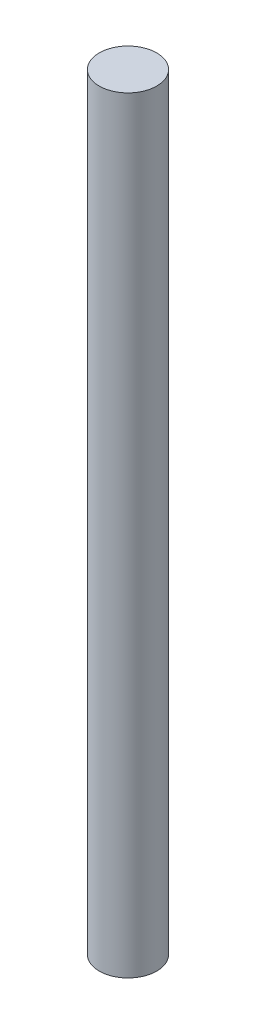
ISO-10303-21;
HEADER;
FILE_DESCRIPTION(('STEP AP214'),'2;1');
FILE_NAME('part.step','',(''),(''),'','','');
FILE_SCHEMA(('AUTOMOTIVE_DESIGN { 1 0 10303 214 1 1 1 1 }'));
ENDSEC;
DATA;
#1=APPLICATION_CONTEXT('core data for automotive mechanical design processes');
#2=APPLICATION_PROTOCOL_DEFINITION('international standard','automotive_design',2000,#1);
#3=PRODUCT_CONTEXT('',#1,'mechanical');
#4=PRODUCT('Part','Part','',(#3));
#5=PRODUCT_RELATED_PRODUCT_CATEGORY('part','',(#4));
#6=PRODUCT_DEFINITION_FORMATION('','',#4);
#7=PRODUCT_DEFINITION_CONTEXT('part definition',#1,'design');
#8=PRODUCT_DEFINITION('design','',#6,#7);
#9=PRODUCT_DEFINITION_SHAPE('','',#8);
#10=(LENGTH_UNIT() NAMED_UNIT(*) SI_UNIT(.MILLI.,.METRE.));
#11=(NAMED_UNIT(*) PLANE_ANGLE_UNIT() SI_UNIT($,.RADIAN.));
#12=(NAMED_UNIT(*) SI_UNIT($,.STERADIAN.) SOLID_ANGLE_UNIT());
#13=UNCERTAINTY_MEASURE_WITH_UNIT(LENGTH_MEASURE(1.E-05),#10,'distance_accuracy_value','');
#14=(GEOMETRIC_REPRESENTATION_CONTEXT(3) GLOBAL_UNCERTAINTY_ASSIGNED_CONTEXT((#13)) GLOBAL_UNIT_ASSIGNED_CONTEXT((#10,
#11,#12)) REPRESENTATION_CONTEXT('',''));
#15=CARTESIAN_POINT('',(0.,0.,0.));
#16=DIRECTION('',(0.,0.,1.));
#17=DIRECTION('',(1.,0.,0.));
#18=AXIS2_PLACEMENT_3D('',#15,#16,#17);
#19=CARTESIAN_POINT('',(0.,200.,0.));
#20=DIRECTION('',(0.,-1.,0.));
#21=DIRECTION('',(0.,0.,-1.));
#22=AXIS2_PLACEMENT_3D('',#19,#20,#21);
#23=CYLINDRICAL_SURFACE('',#22,7.5);
#24=CARTESIAN_POINT('',(0.,200.,0.));
#25=DIRECTION('',(0.,1.,0.));
#26=DIRECTION('',(0.,0.,1.));
#27=AXIS2_PLACEMENT_3D('',#24,#25,#26);
#28=CIRCLE('',#27,7.5);
#29=CARTESIAN_POINT('',(0.,200.,7.5));
#30=VERTEX_POINT('',#29);
#31=EDGE_CURVE('E10',#30,#30,#28,.T.);
#32=ORIENTED_EDGE('',*,*,#31,.F.);
#33=EDGE_LOOP('',(#32));
#34=FACE_BOUND('',#33,.T.);
#35=CARTESIAN_POINT('',(0.,0.,0.));
#36=DIRECTION('',(0.,1.,0.));
#37=DIRECTION('',(0.,0.,1.));
#38=AXIS2_PLACEMENT_3D('',#35,#36,#37);
#39=CIRCLE('',#38,7.5);
#40=CARTESIAN_POINT('',(0.,0.,7.5));
#41=VERTEX_POINT('',#40);
#42=EDGE_CURVE('E40',#41,#41,#39,.T.);
#43=ORIENTED_EDGE('',*,*,#42,.T.);
#44=EDGE_LOOP('',(#43));
#45=FACE_BOUND('',#44,.T.);
#46=ADVANCED_FACE('F37',(#34,#45),#23,.T.);
#47=CARTESIAN_POINT('',(0.,200.,0.));
#48=DIRECTION('',(0.,1.,0.));
#49=DIRECTION('',(0.,0.,1.));
#50=AXIS2_PLACEMENT_3D('',#47,#48,#49);
#51=PLANE('',#50);
#52=ORIENTED_EDGE('',*,*,#31,.T.);
#53=EDGE_LOOP('',(#52));
#54=FACE_BOUND('',#53,.T.);
#55=ADVANCED_FACE('F52',(#54),#51,.T.);
#56=CARTESIAN_POINT('',(0.,0.,0.));
#57=DIRECTION('',(0.,1.,0.));
#58=DIRECTION('',(0.,0.,1.));
#59=AXIS2_PLACEMENT_3D('',#56,#57,#58);
#60=PLANE('',#59);
#61=ORIENTED_EDGE('',*,*,#42,.F.);
#62=EDGE_LOOP('',(#61));
#63=FACE_BOUND('',#62,.T.);
#64=ADVANCED_FACE('F50',(#63),#60,.F.);
#65=CLOSED_SHELL('',(#46,#55,#64));
#66=MANIFOLD_SOLID_BREP('B2',#65);
#67=ADVANCED_BREP_SHAPE_REPRESENTATION('',(#18,#66),#14);
#68=SHAPE_DEFINITION_REPRESENTATION(#9,#67);
ENDSEC;
END-ISO-10303-21;
